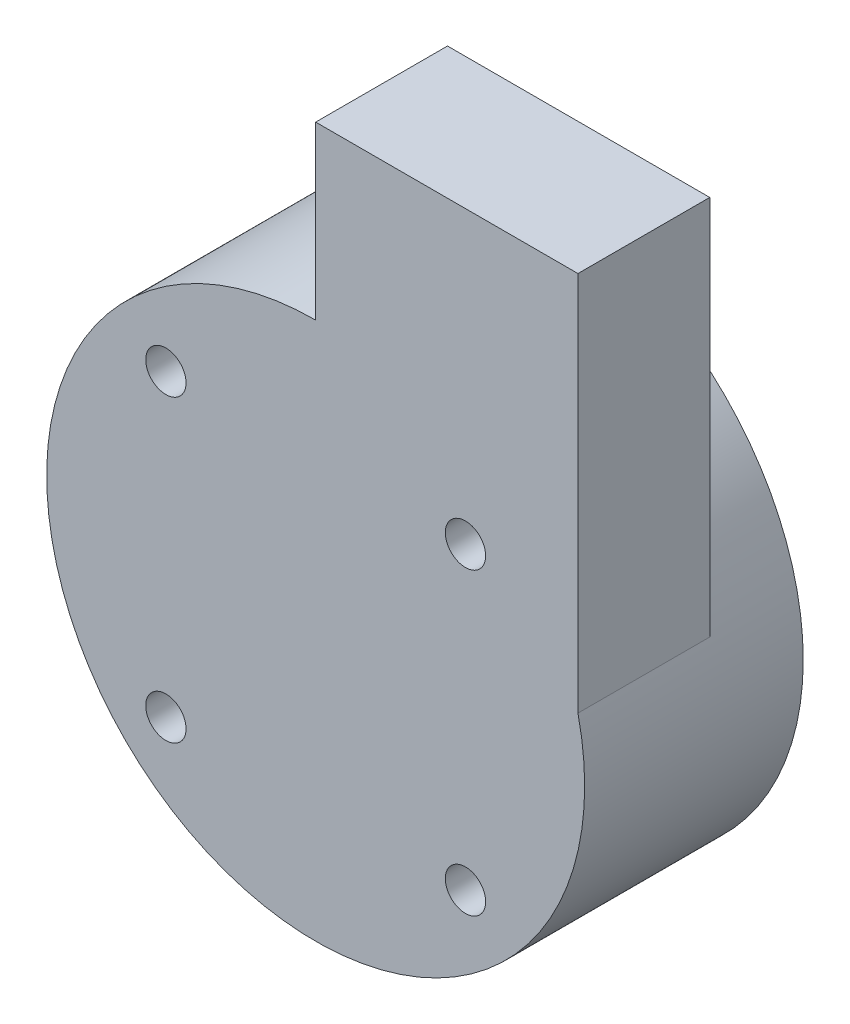
ISO-10303-21;
HEADER;
FILE_DESCRIPTION(('STEP AP214'),'2;1');
FILE_NAME('part.step','',(''),(''),'','','');
FILE_SCHEMA(('AUTOMOTIVE_DESIGN { 1 0 10303 214 1 1 1 1 }'));
ENDSEC;
DATA;
#1=APPLICATION_CONTEXT('core data for automotive mechanical design processes');
#2=APPLICATION_PROTOCOL_DEFINITION('international standard','automotive_design',2000,#1);
#3=PRODUCT_CONTEXT('',#1,'mechanical');
#4=PRODUCT('Part','Part','',(#3));
#5=PRODUCT_RELATED_PRODUCT_CATEGORY('part','',(#4));
#6=PRODUCT_DEFINITION_FORMATION('','',#4);
#7=PRODUCT_DEFINITION_CONTEXT('part definition',#1,'design');
#8=PRODUCT_DEFINITION('design','',#6,#7);
#9=PRODUCT_DEFINITION_SHAPE('','',#8);
#10=(LENGTH_UNIT() NAMED_UNIT(*) SI_UNIT(.MILLI.,.METRE.));
#11=(NAMED_UNIT(*) PLANE_ANGLE_UNIT() SI_UNIT($,.RADIAN.));
#12=(NAMED_UNIT(*) SI_UNIT($,.STERADIAN.) SOLID_ANGLE_UNIT());
#13=UNCERTAINTY_MEASURE_WITH_UNIT(LENGTH_MEASURE(1.E-05),#10,'distance_accuracy_value','');
#14=(GEOMETRIC_REPRESENTATION_CONTEXT(3) GLOBAL_UNCERTAINTY_ASSIGNED_CONTEXT((#13)) GLOBAL_UNIT_ASSIGNED_CONTEXT((#10,
#11,#12)) REPRESENTATION_CONTEXT('',''));
#15=CARTESIAN_POINT('',(0.,0.,0.));
#16=DIRECTION('',(0.,0.,1.));
#17=DIRECTION('',(1.,0.,0.));
#18=AXIS2_PLACEMENT_3D('',#15,#16,#17);
#19=CARTESIAN_POINT('',(0.,0.,32.5));
#20=DIRECTION('',(0.,0.,-1.));
#21=DIRECTION('',(-1.,0.,0.));
#22=AXIS2_PLACEMENT_3D('',#19,#20,#21);
#23=CYLINDRICAL_SURFACE('',#22,40.);
#24=CARTESIAN_POINT('',(0.,0.,0.));
#25=DIRECTION('',(0.,0.,1.));
#26=DIRECTION('',(1.,0.,0.));
#27=AXIS2_PLACEMENT_3D('',#24,#25,#26);
#28=CIRCLE('',#27,40.);
#29=CARTESIAN_POINT('',(40.,0.,0.));
#30=VERTEX_POINT('',#29);
#31=EDGE_CURVE('E122',#30,#30,#28,.T.);
#32=ORIENTED_EDGE('',*,*,#31,.T.);
#33=EDGE_LOOP('',(#32));
#34=FACE_BOUND('',#33,.T.);
#35=DIRECTION('',(0.,0.,-1.));
#36=VECTOR('',#35,1.);
#37=CARTESIAN_POINT('',(39.,8.88819441731559,32.5));
#38=LINE('',#37,#36);
#39=CARTESIAN_POINT('',(39.,8.88819441731559,32.5));
#40=VERTEX_POINT('',#39);
#41=CARTESIAN_POINT('',(39.,8.88819441731559,12.9));
#42=VERTEX_POINT('',#41);
#43=EDGE_CURVE('E11',#40,#42,#38,.T.);
#44=ORIENTED_EDGE('',*,*,#43,.F.);
#45=CARTESIAN_POINT('',(0.,0.,32.5));
#46=DIRECTION('',(0.,0.,1.));
#47=DIRECTION('',(1.,0.,0.));
#48=AXIS2_PLACEMENT_3D('',#45,#46,#47);
#49=CIRCLE('',#48,40.);
#50=CARTESIAN_POINT('',(0.,40.,32.5));
#51=VERTEX_POINT('',#50);
#52=EDGE_CURVE('E125',#51,#40,#49,.T.);
#53=ORIENTED_EDGE('',*,*,#52,.F.);
#54=DIRECTION('',(0.,0.,-1.));
#55=VECTOR('',#54,1.);
#56=CARTESIAN_POINT('',(0.,40.,32.5));
#57=LINE('',#56,#55);
#58=CARTESIAN_POINT('',(0.,40.,12.9));
#59=VERTEX_POINT('',#58);
#60=EDGE_CURVE('E43',#51,#59,#57,.T.);
#61=ORIENTED_EDGE('',*,*,#60,.T.);
#62=CARTESIAN_POINT('',(0.,0.,12.9));
#63=DIRECTION('',(0.,0.,1.));
#64=DIRECTION('',(1.,0.,0.));
#65=AXIS2_PLACEMENT_3D('',#62,#63,#64);
#66=CIRCLE('',#65,40.);
#67=EDGE_CURVE('E86',#42,#59,#66,.T.);
#68=ORIENTED_EDGE('',*,*,#67,.F.);
#69=EDGE_LOOP('',(#44,#53,#61,#68));
#70=FACE_BOUND('',#69,.T.);
#71=ADVANCED_FACE('F36',(#34,#70),#23,.T.);
#72=CARTESIAN_POINT('',(22.2738636073763,22.2738636073763,32.5));
#73=DIRECTION('',(0.,0.,-1.));
#74=DIRECTION('',(-1.,0.,0.));
#75=AXIS2_PLACEMENT_3D('',#72,#73,#74);
#76=CYLINDRICAL_SURFACE('',#75,3.);
#77=CARTESIAN_POINT('',(22.2738636073763,22.2738636073763,0.));
#78=DIRECTION('',(0.,0.,1.));
#79=DIRECTION('',(1.,0.,0.));
#80=AXIS2_PLACEMENT_3D('',#77,#78,#79);
#81=CIRCLE('',#80,3.);
#82=CARTESIAN_POINT('',(25.2738636073763,22.2738636073763,0.));
#83=VERTEX_POINT('',#82);
#84=EDGE_CURVE('E113',#83,#83,#81,.T.);
#85=ORIENTED_EDGE('',*,*,#84,.F.);
#86=EDGE_LOOP('',(#85));
#87=FACE_BOUND('',#86,.T.);
#88=CARTESIAN_POINT('',(22.2738636073762,22.2738636073763,32.5));
#89=DIRECTION('',(0.,0.,1.));
#90=DIRECTION('',(1.,0.,0.));
#91=AXIS2_PLACEMENT_3D('',#88,#89,#90);
#92=CIRCLE('',#91,2.99999999999999);
#93=CARTESIAN_POINT('',(25.2738636073762,22.2738636073763,32.5));
#94=VERTEX_POINT('',#93);
#95=EDGE_CURVE('E98',#94,#94,#92,.F.);
#96=ORIENTED_EDGE('',*,*,#95,.F.);
#97=EDGE_LOOP('',(#96));
#98=FACE_BOUND('',#97,.T.);
#99=ADVANCED_FACE('F142',(#87,#98),#76,.F.);
#100=CARTESIAN_POINT('',(0.,0.,32.5));
#101=DIRECTION('',(0.,0.,1.));
#102=DIRECTION('',(1.,0.,0.));
#103=AXIS2_PLACEMENT_3D('',#100,#101,#102);
#104=PLANE('',#103);
#105=ORIENTED_EDGE('',*,*,#95,.T.);
#106=EDGE_LOOP('',(#105));
#107=FACE_BOUND('',#106,.T.);
#108=ORIENTED_EDGE('',*,*,#52,.T.);
#109=DIRECTION('',(0.,-1.,0.));
#110=VECTOR('',#109,1.);
#111=CARTESIAN_POINT('',(39.,0.,32.5));
#112=LINE('',#111,#110);
#113=CARTESIAN_POINT('',(39.,65.5,32.5));
#114=VERTEX_POINT('',#113);
#115=EDGE_CURVE('E57',#114,#40,#112,.T.);
#116=ORIENTED_EDGE('',*,*,#115,.F.);
#117=DIRECTION('',(-1.,0.,0.));
#118=VECTOR('',#117,1.);
#119=CARTESIAN_POINT('',(39.,65.5,32.5));
#120=LINE('',#119,#118);
#121=CARTESIAN_POINT('',(0.,65.5,32.5));
#122=VERTEX_POINT('',#121);
#123=EDGE_CURVE('E87',#114,#122,#120,.T.);
#124=ORIENTED_EDGE('',*,*,#123,.T.);
#125=DIRECTION('',(0.,-1.,0.));
#126=VECTOR('',#125,1.);
#127=CARTESIAN_POINT('',(0.,0.,32.5));
#128=LINE('',#127,#126);
#129=EDGE_CURVE('E95',#122,#51,#128,.T.);
#130=ORIENTED_EDGE('',*,*,#129,.T.);
#131=EDGE_LOOP('',(#108,#116,#124,#130));
#132=FACE_BOUND('',#131,.T.);
#133=CARTESIAN_POINT('',(-22.2738636073762,-22.2738636073762,32.5));
#134=DIRECTION('',(0.,0.,1.));
#135=DIRECTION('',(1.,0.,0.));
#136=AXIS2_PLACEMENT_3D('',#133,#134,#135);
#137=CIRCLE('',#136,3.);
#138=CARTESIAN_POINT('',(-19.2738636073762,-22.2738636073762,32.5));
#139=VERTEX_POINT('',#138);
#140=EDGE_CURVE('E104',#139,#139,#137,.T.);
#141=ORIENTED_EDGE('',*,*,#140,.F.);
#142=EDGE_LOOP('',(#141));
#143=FACE_BOUND('',#142,.T.);
#144=CARTESIAN_POINT('',(-22.2738636073762,22.2738636073763,32.5));
#145=DIRECTION('',(0.,0.,1.));
#146=DIRECTION('',(1.,0.,0.));
#147=AXIS2_PLACEMENT_3D('',#144,#145,#146);
#148=CIRCLE('',#147,3.);
#149=CARTESIAN_POINT('',(-19.2738636073762,22.2738636073763,32.5));
#150=VERTEX_POINT('',#149);
#151=EDGE_CURVE('E119',#150,#150,#148,.T.);
#152=ORIENTED_EDGE('',*,*,#151,.F.);
#153=EDGE_LOOP('',(#152));
#154=FACE_BOUND('',#153,.T.);
#155=CARTESIAN_POINT('',(22.2738636073763,-22.2738636073762,32.5));
#156=DIRECTION('',(0.,0.,1.));
#157=DIRECTION('',(1.,0.,0.));
#158=AXIS2_PLACEMENT_3D('',#155,#156,#157);
#159=CIRCLE('',#158,3.);
#160=CARTESIAN_POINT('',(25.2738636073763,-22.2738636073762,32.5));
#161=VERTEX_POINT('',#160);
#162=EDGE_CURVE('E110',#161,#161,#159,.T.);
#163=ORIENTED_EDGE('',*,*,#162,.F.);
#164=EDGE_LOOP('',(#163));
#165=FACE_BOUND('',#164,.T.);
#166=ADVANCED_FACE('F135',(#107,#132,#143,#154,#165),#104,.T.);
#167=CARTESIAN_POINT('',(0.,0.,0.));
#168=DIRECTION('',(0.,0.,1.));
#169=DIRECTION('',(1.,0.,0.));
#170=AXIS2_PLACEMENT_3D('',#167,#168,#169);
#171=PLANE('',#170);
#172=ORIENTED_EDGE('',*,*,#31,.F.);
#173=EDGE_LOOP('',(#172));
#174=FACE_BOUND('',#173,.T.);
#175=CARTESIAN_POINT('',(-22.2738636073762,22.2738636073763,0.));
#176=DIRECTION('',(0.,0.,1.));
#177=DIRECTION('',(1.,0.,0.));
#178=AXIS2_PLACEMENT_3D('',#175,#176,#177);
#179=CIRCLE('',#178,3.);
#180=CARTESIAN_POINT('',(-19.2738636073762,22.2738636073763,0.));
#181=VERTEX_POINT('',#180);
#182=EDGE_CURVE('E118',#181,#181,#179,.T.);
#183=ORIENTED_EDGE('',*,*,#182,.T.);
#184=EDGE_LOOP('',(#183));
#185=FACE_BOUND('',#184,.T.);
#186=ORIENTED_EDGE('',*,*,#84,.T.);
#187=EDGE_LOOP('',(#186));
#188=FACE_BOUND('',#187,.T.);
#189=CARTESIAN_POINT('',(22.2738636073763,-22.2738636073762,0.));
#190=DIRECTION('',(0.,0.,1.));
#191=DIRECTION('',(1.,0.,0.));
#192=AXIS2_PLACEMENT_3D('',#189,#190,#191);
#193=CIRCLE('',#192,3.);
#194=CARTESIAN_POINT('',(25.2738636073763,-22.2738636073762,0.));
#195=VERTEX_POINT('',#194);
#196=EDGE_CURVE('E107',#195,#195,#193,.T.);
#197=ORIENTED_EDGE('',*,*,#196,.T.);
#198=EDGE_LOOP('',(#197));
#199=FACE_BOUND('',#198,.T.);
#200=CARTESIAN_POINT('',(-22.2738636073762,-22.2738636073762,0.));
#201=DIRECTION('',(0.,0.,1.));
#202=DIRECTION('',(1.,0.,0.));
#203=AXIS2_PLACEMENT_3D('',#200,#201,#202);
#204=CIRCLE('',#203,3.);
#205=CARTESIAN_POINT('',(-19.2738636073762,-22.2738636073762,0.));
#206=VERTEX_POINT('',#205);
#207=EDGE_CURVE('E103',#206,#206,#204,.T.);
#208=ORIENTED_EDGE('',*,*,#207,.T.);
#209=EDGE_LOOP('',(#208));
#210=FACE_BOUND('',#209,.T.);
#211=ADVANCED_FACE('F150',(#174,#185,#188,#199,#210),#171,.F.);
#212=CARTESIAN_POINT('',(-22.2738636073762,22.2738636073763,32.5));
#213=DIRECTION('',(0.,0.,-1.));
#214=DIRECTION('',(-1.,0.,0.));
#215=AXIS2_PLACEMENT_3D('',#212,#213,#214);
#216=CYLINDRICAL_SURFACE('',#215,3.);
#217=ORIENTED_EDGE('',*,*,#151,.T.);
#218=EDGE_LOOP('',(#217));
#219=FACE_BOUND('',#218,.T.);
#220=ORIENTED_EDGE('',*,*,#182,.F.);
#221=EDGE_LOOP('',(#220));
#222=FACE_BOUND('',#221,.T.);
#223=ADVANCED_FACE('F158',(#219,#222),#216,.F.);
#224=CARTESIAN_POINT('',(22.2738636073763,-22.2738636073762,32.5));
#225=DIRECTION('',(0.,0.,-1.));
#226=DIRECTION('',(-1.,0.,0.));
#227=AXIS2_PLACEMENT_3D('',#224,#225,#226);
#228=CYLINDRICAL_SURFACE('',#227,3.);
#229=ORIENTED_EDGE('',*,*,#162,.T.);
#230=EDGE_LOOP('',(#229));
#231=FACE_BOUND('',#230,.T.);
#232=ORIENTED_EDGE('',*,*,#196,.F.);
#233=EDGE_LOOP('',(#232));
#234=FACE_BOUND('',#233,.T.);
#235=ADVANCED_FACE('F156',(#231,#234),#228,.F.);
#236=CARTESIAN_POINT('',(-22.2738636073762,-22.2738636073762,32.5));
#237=DIRECTION('',(0.,0.,-1.));
#238=DIRECTION('',(-1.,0.,0.));
#239=AXIS2_PLACEMENT_3D('',#236,#237,#238);
#240=CYLINDRICAL_SURFACE('',#239,3.);
#241=ORIENTED_EDGE('',*,*,#140,.T.);
#242=EDGE_LOOP('',(#241));
#243=FACE_BOUND('',#242,.T.);
#244=ORIENTED_EDGE('',*,*,#207,.F.);
#245=EDGE_LOOP('',(#244));
#246=FACE_BOUND('',#245,.T.);
#247=ADVANCED_FACE('F174',(#243,#246),#240,.F.);
#248=CARTESIAN_POINT('',(39.,0.,0.));
#249=DIRECTION('',(-1.,0.,0.));
#250=DIRECTION('',(0.,0.,1.));
#251=AXIS2_PLACEMENT_3D('',#248,#249,#250);
#252=PLANE('',#251);
#253=ORIENTED_EDGE('',*,*,#115,.T.);
#254=ORIENTED_EDGE('',*,*,#43,.T.);
#255=DIRECTION('',(0.,1.,0.));
#256=VECTOR('',#255,1.);
#257=CARTESIAN_POINT('',(39.,0.,12.9));
#258=LINE('',#257,#256);
#259=CARTESIAN_POINT('',(39.,65.5,12.9));
#260=VERTEX_POINT('',#259);
#261=EDGE_CURVE('E73',#42,#260,#258,.T.);
#262=ORIENTED_EDGE('',*,*,#261,.T.);
#263=DIRECTION('',(0.,0.,1.));
#264=VECTOR('',#263,1.);
#265=CARTESIAN_POINT('',(39.,65.5,32.5));
#266=LINE('',#265,#264);
#267=EDGE_CURVE('E77',#260,#114,#266,.T.);
#268=ORIENTED_EDGE('',*,*,#267,.T.);
#269=EDGE_LOOP('',(#253,#254,#262,#268));
#270=FACE_BOUND('',#269,.T.);
#271=ADVANCED_FACE('F75',(#270),#252,.F.);
#272=CARTESIAN_POINT('',(0.,0.,0.));
#273=DIRECTION('',(-1.,0.,0.));
#274=DIRECTION('',(0.,0.,1.));
#275=AXIS2_PLACEMENT_3D('',#272,#273,#274);
#276=PLANE('',#275);
#277=ORIENTED_EDGE('',*,*,#60,.F.);
#278=ORIENTED_EDGE('',*,*,#129,.F.);
#279=DIRECTION('',(0.,0.,1.));
#280=VECTOR('',#279,1.);
#281=CARTESIAN_POINT('',(0.,65.5,32.5));
#282=LINE('',#281,#280);
#283=CARTESIAN_POINT('',(0.,65.5,12.9));
#284=VERTEX_POINT('',#283);
#285=EDGE_CURVE('E100',#284,#122,#282,.T.);
#286=ORIENTED_EDGE('',*,*,#285,.F.);
#287=DIRECTION('',(0.,1.,0.));
#288=VECTOR('',#287,1.);
#289=CARTESIAN_POINT('',(0.,0.,12.9));
#290=LINE('',#289,#288);
#291=EDGE_CURVE('E50',#59,#284,#290,.T.);
#292=ORIENTED_EDGE('',*,*,#291,.F.);
#293=EDGE_LOOP('',(#277,#278,#286,#292));
#294=FACE_BOUND('',#293,.T.);
#295=ADVANCED_FACE('F133',(#294),#276,.T.);
#296=CARTESIAN_POINT('',(39.,0.,12.9));
#297=DIRECTION('',(0.,0.,1.));
#298=DIRECTION('',(1.,0.,0.));
#299=AXIS2_PLACEMENT_3D('',#296,#297,#298);
#300=PLANE('',#299);
#301=ORIENTED_EDGE('',*,*,#261,.F.);
#302=ORIENTED_EDGE('',*,*,#67,.T.);
#303=ORIENTED_EDGE('',*,*,#291,.T.);
#304=DIRECTION('',(-1.,0.,0.));
#305=VECTOR('',#304,1.);
#306=CARTESIAN_POINT('',(39.,65.5,12.9));
#307=LINE('',#306,#305);
#308=EDGE_CURVE('E83',#260,#284,#307,.T.);
#309=ORIENTED_EDGE('',*,*,#308,.F.);
#310=EDGE_LOOP('',(#301,#302,#303,#309));
#311=FACE_BOUND('',#310,.T.);
#312=ADVANCED_FACE('F84',(#311),#300,.F.);
#313=CARTESIAN_POINT('',(39.,65.5,32.5));
#314=DIRECTION('',(0.,-1.,0.));
#315=DIRECTION('',(0.,0.,-1.));
#316=AXIS2_PLACEMENT_3D('',#313,#314,#315);
#317=PLANE('',#316);
#318=ORIENTED_EDGE('',*,*,#285,.T.);
#319=ORIENTED_EDGE('',*,*,#123,.F.);
#320=ORIENTED_EDGE('',*,*,#267,.F.);
#321=ORIENTED_EDGE('',*,*,#308,.T.);
#322=EDGE_LOOP('',(#318,#319,#320,#321));
#323=FACE_BOUND('',#322,.T.);
#324=ADVANCED_FACE('F89',(#323),#317,.F.);
#325=CLOSED_SHELL('',(#71,#99,#166,#211,#223,#235,#247,#271,#295,#312,#324));
#326=MANIFOLD_SOLID_BREP('B2',#325);
#327=ADVANCED_BREP_SHAPE_REPRESENTATION('',(#18,#326),#14);
#328=SHAPE_DEFINITION_REPRESENTATION(#9,#327);
ENDSEC;
END-ISO-10303-21;
